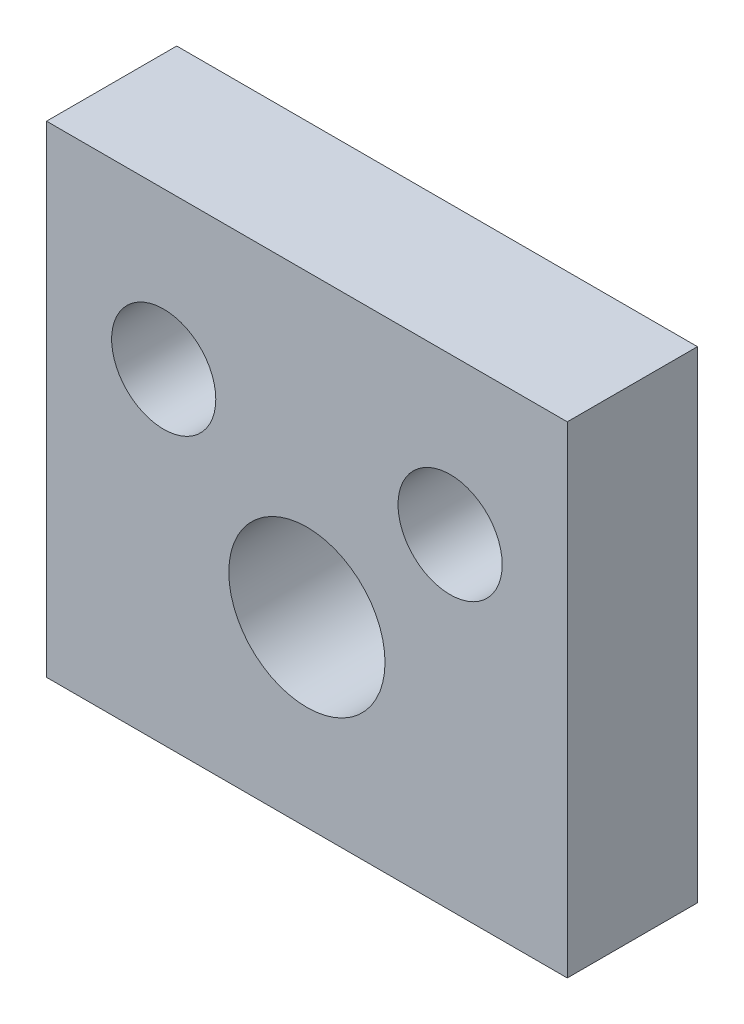
ISO-10303-21;
HEADER;
FILE_DESCRIPTION(('STEP AP214'),'2;1');
FILE_NAME('part.step','',(''),(''),'','','');
FILE_SCHEMA(('AUTOMOTIVE_DESIGN { 1 0 10303 214 1 1 1 1 }'));
ENDSEC;
DATA;
#1=APPLICATION_CONTEXT('core data for automotive mechanical design processes');
#2=APPLICATION_PROTOCOL_DEFINITION('international standard','automotive_design',2000,#1);
#3=PRODUCT_CONTEXT('',#1,'mechanical');
#4=PRODUCT('Part','Part','',(#3));
#5=PRODUCT_RELATED_PRODUCT_CATEGORY('part','',(#4));
#6=PRODUCT_DEFINITION_FORMATION('','',#4);
#7=PRODUCT_DEFINITION_CONTEXT('part definition',#1,'design');
#8=PRODUCT_DEFINITION('design','',#6,#7);
#9=PRODUCT_DEFINITION_SHAPE('','',#8);
#10=(LENGTH_UNIT() NAMED_UNIT(*) SI_UNIT(.MILLI.,.METRE.));
#11=(NAMED_UNIT(*) PLANE_ANGLE_UNIT() SI_UNIT($,.RADIAN.));
#12=(NAMED_UNIT(*) SI_UNIT($,.STERADIAN.) SOLID_ANGLE_UNIT());
#13=UNCERTAINTY_MEASURE_WITH_UNIT(LENGTH_MEASURE(1.E-05),#10,'distance_accuracy_value','');
#14=(GEOMETRIC_REPRESENTATION_CONTEXT(3) GLOBAL_UNCERTAINTY_ASSIGNED_CONTEXT((#13)) GLOBAL_UNIT_ASSIGNED_CONTEXT((#10,
#11,#12)) REPRESENTATION_CONTEXT('',''));
#15=CARTESIAN_POINT('',(0.,0.,0.));
#16=DIRECTION('',(0.,0.,1.));
#17=DIRECTION('',(1.,0.,0.));
#18=AXIS2_PLACEMENT_3D('',#15,#16,#17);
#19=CARTESIAN_POINT('',(6.43178730437478,-23.1504866904766,5.));
#20=DIRECTION('',(1.,0.,0.));
#21=DIRECTION('',(0.,1.,0.));
#22=AXIS2_PLACEMENT_3D('',#19,#20,#21);
#23=PLANE('',#22);
#24=DIRECTION('',(0.,-1.,0.));
#25=VECTOR('',#24,1.);
#26=CARTESIAN_POINT('',(6.43178730437478,-23.1504866904766,0.));
#27=LINE('',#26,#25);
#28=CARTESIAN_POINT('',(6.43178730437478,7.432,0.));
#29=VERTEX_POINT('',#28);
#30=CARTESIAN_POINT('',(6.43178730437478,-11.068,0.));
#31=VERTEX_POINT('',#30);
#32=EDGE_CURVE('E112',#29,#31,#27,.T.);
#33=ORIENTED_EDGE('',*,*,#32,.F.);
#34=DIRECTION('',(0.,0.,-1.));
#35=VECTOR('',#34,1.);
#36=CARTESIAN_POINT('',(6.43178730437478,7.432,5.));
#37=LINE('',#36,#35);
#38=CARTESIAN_POINT('',(6.43178730437478,7.432,5.));
#39=VERTEX_POINT('',#38);
#40=EDGE_CURVE('E11',#39,#29,#37,.T.);
#41=ORIENTED_EDGE('',*,*,#40,.F.);
#42=DIRECTION('',(0.,-1.,0.));
#43=VECTOR('',#42,1.);
#44=CARTESIAN_POINT('',(6.43178730437478,-23.1504866904766,5.));
#45=LINE('',#44,#43);
#46=CARTESIAN_POINT('',(6.43178730437478,-11.068,5.));
#47=VERTEX_POINT('',#46);
#48=EDGE_CURVE('E96',#39,#47,#45,.T.);
#49=ORIENTED_EDGE('',*,*,#48,.T.);
#50=DIRECTION('',(0.,0.,-1.));
#51=VECTOR('',#50,1.);
#52=CARTESIAN_POINT('',(6.43178730437478,-11.068,5.));
#53=LINE('',#52,#51);
#54=EDGE_CURVE('E74',#47,#31,#53,.T.);
#55=ORIENTED_EDGE('',*,*,#54,.T.);
#56=EDGE_LOOP('',(#33,#41,#49,#55));
#57=FACE_BOUND('',#56,.T.);
#58=ADVANCED_FACE('F34',(#57),#23,.T.);
#59=CARTESIAN_POINT('',(-3.56821269562522,7.432,5.));
#60=DIRECTION('',(0.,1.,0.));
#61=DIRECTION('',(-1.,0.,0.));
#62=AXIS2_PLACEMENT_3D('',#59,#60,#61);
#63=PLANE('',#62);
#64=DIRECTION('',(1.,0.,0.));
#65=VECTOR('',#64,1.);
#66=CARTESIAN_POINT('',(-3.56821269562522,7.432,0.));
#67=LINE('',#66,#65);
#68=CARTESIAN_POINT('',(-13.5682126956252,7.432,0.));
#69=VERTEX_POINT('',#68);
#70=EDGE_CURVE('E86',#69,#29,#67,.T.);
#71=ORIENTED_EDGE('',*,*,#70,.F.);
#72=DIRECTION('',(0.,0.,-1.));
#73=VECTOR('',#72,1.);
#74=CARTESIAN_POINT('',(-13.5682126956252,7.432,5.));
#75=LINE('',#74,#73);
#76=CARTESIAN_POINT('',(-13.5682126956252,7.432,5.));
#77=VERTEX_POINT('',#76);
#78=EDGE_CURVE('E43',#77,#69,#75,.T.);
#79=ORIENTED_EDGE('',*,*,#78,.F.);
#80=DIRECTION('',(1.,0.,0.));
#81=VECTOR('',#80,1.);
#82=CARTESIAN_POINT('',(-3.56821269562522,7.432,5.));
#83=LINE('',#82,#81);
#84=EDGE_CURVE('E84',#77,#39,#83,.T.);
#85=ORIENTED_EDGE('',*,*,#84,.T.);
#86=ORIENTED_EDGE('',*,*,#40,.T.);
#87=EDGE_LOOP('',(#71,#79,#85,#86));
#88=FACE_BOUND('',#87,.T.);
#89=ADVANCED_FACE('F82',(#88),#63,.T.);
#90=CARTESIAN_POINT('',(-13.5682126956252,-23.1504866904766,5.));
#91=DIRECTION('',(1.,0.,0.));
#92=DIRECTION('',(0.,0.,-1.));
#93=AXIS2_PLACEMENT_3D('',#90,#91,#92);
#94=PLANE('',#93);
#95=DIRECTION('',(0.,-1.,0.));
#96=VECTOR('',#95,1.);
#97=CARTESIAN_POINT('',(-13.5682126956252,-23.1504866904766,0.));
#98=LINE('',#97,#96);
#99=CARTESIAN_POINT('',(-13.5682126956252,-11.068,0.));
#100=VERTEX_POINT('',#99);
#101=EDGE_CURVE('E115',#69,#100,#98,.T.);
#102=ORIENTED_EDGE('',*,*,#101,.T.);
#103=DIRECTION('',(0.,0.,-1.));
#104=VECTOR('',#103,1.);
#105=CARTESIAN_POINT('',(-13.5682126956252,-11.068,5.));
#106=LINE('',#105,#104);
#107=CARTESIAN_POINT('',(-13.5682126956252,-11.068,5.));
#108=VERTEX_POINT('',#107);
#109=EDGE_CURVE('E89',#108,#100,#106,.T.);
#110=ORIENTED_EDGE('',*,*,#109,.F.);
#111=DIRECTION('',(0.,-1.,0.));
#112=VECTOR('',#111,1.);
#113=CARTESIAN_POINT('',(-13.5682126956252,-23.1504866904766,5.));
#114=LINE('',#113,#112);
#115=EDGE_CURVE('E91',#77,#108,#114,.T.);
#116=ORIENTED_EDGE('',*,*,#115,.F.);
#117=ORIENTED_EDGE('',*,*,#78,.T.);
#118=EDGE_LOOP('',(#102,#110,#116,#117));
#119=FACE_BOUND('',#118,.T.);
#120=ADVANCED_FACE('F92',(#119),#94,.F.);
#121=CARTESIAN_POINT('',(-9.06821269562522,1.432,5.));
#122=DIRECTION('',(0.,0.,-1.));
#123=DIRECTION('',(-1.,0.,0.));
#124=AXIS2_PLACEMENT_3D('',#121,#122,#123);
#125=CYLINDRICAL_SURFACE('',#124,2.);
#126=CARTESIAN_POINT('',(-9.06821269562522,1.432,5.));
#127=DIRECTION('',(0.,0.,1.));
#128=DIRECTION('',(1.,0.,0.));
#129=AXIS2_PLACEMENT_3D('',#126,#127,#128);
#130=CIRCLE('',#129,2.);
#131=CARTESIAN_POINT('',(-7.06821269562522,1.432,5.));
#132=VERTEX_POINT('',#131);
#133=EDGE_CURVE('E103',#132,#132,#130,.T.);
#134=ORIENTED_EDGE('',*,*,#133,.T.);
#135=EDGE_LOOP('',(#134));
#136=FACE_BOUND('',#135,.T.);
#137=CARTESIAN_POINT('',(-9.06821269562522,1.432,0.));
#138=DIRECTION('',(0.,0.,1.));
#139=DIRECTION('',(1.,0.,0.));
#140=AXIS2_PLACEMENT_3D('',#137,#138,#139);
#141=CIRCLE('',#140,2.);
#142=CARTESIAN_POINT('',(-7.06821269562522,1.432,0.));
#143=VERTEX_POINT('',#142);
#144=EDGE_CURVE('E118',#143,#143,#141,.T.);
#145=ORIENTED_EDGE('',*,*,#144,.F.);
#146=EDGE_LOOP('',(#145));
#147=FACE_BOUND('',#146,.T.);
#148=ADVANCED_FACE('F136',(#136,#147),#125,.F.);
#149=CARTESIAN_POINT('',(-3.56821269562522,-11.068,5.));
#150=DIRECTION('',(0.,1.,0.));
#151=DIRECTION('',(-1.,0.,0.));
#152=AXIS2_PLACEMENT_3D('',#149,#150,#151);
#153=PLANE('',#152);
#154=DIRECTION('',(1.,0.,0.));
#155=VECTOR('',#154,1.);
#156=CARTESIAN_POINT('',(-3.56821269562522,-11.068,0.));
#157=LINE('',#156,#155);
#158=EDGE_CURVE('E67',#100,#31,#157,.T.);
#159=ORIENTED_EDGE('',*,*,#158,.T.);
#160=ORIENTED_EDGE('',*,*,#54,.F.);
#161=DIRECTION('',(1.,0.,0.));
#162=VECTOR('',#161,1.);
#163=CARTESIAN_POINT('',(-3.56821269562522,-11.068,5.));
#164=LINE('',#163,#162);
#165=EDGE_CURVE('E51',#108,#47,#164,.T.);
#166=ORIENTED_EDGE('',*,*,#165,.F.);
#167=ORIENTED_EDGE('',*,*,#109,.T.);
#168=EDGE_LOOP('',(#159,#160,#166,#167));
#169=FACE_BOUND('',#168,.T.);
#170=ADVANCED_FACE('F126',(#169),#153,.F.);
#171=CARTESIAN_POINT('',(-3.56821269562522,-4.068,5.));
#172=DIRECTION('',(0.,0.,-1.));
#173=DIRECTION('',(-1.,0.,0.));
#174=AXIS2_PLACEMENT_3D('',#171,#172,#173);
#175=CYLINDRICAL_SURFACE('',#174,3.);
#176=CARTESIAN_POINT('',(-3.56821269562522,-4.068,5.));
#177=DIRECTION('',(0.,0.,1.));
#178=DIRECTION('',(1.,0.,0.));
#179=AXIS2_PLACEMENT_3D('',#176,#177,#178);
#180=CIRCLE('',#179,3.);
#181=CARTESIAN_POINT('',(-0.568212695625217,-4.068,5.));
#182=VERTEX_POINT('',#181);
#183=EDGE_CURVE('E98',#182,#182,#180,.T.);
#184=ORIENTED_EDGE('',*,*,#183,.T.);
#185=EDGE_LOOP('',(#184));
#186=FACE_BOUND('',#185,.T.);
#187=CARTESIAN_POINT('',(-3.56821269562522,-4.068,0.));
#188=DIRECTION('',(0.,0.,1.));
#189=DIRECTION('',(1.,0.,0.));
#190=AXIS2_PLACEMENT_3D('',#187,#188,#189);
#191=CIRCLE('',#190,3.);
#192=CARTESIAN_POINT('',(-0.568212695625217,-4.068,0.));
#193=VERTEX_POINT('',#192);
#194=EDGE_CURVE('E109',#193,#193,#191,.T.);
#195=ORIENTED_EDGE('',*,*,#194,.F.);
#196=EDGE_LOOP('',(#195));
#197=FACE_BOUND('',#196,.T.);
#198=ADVANCED_FACE('F36',(#186,#197),#175,.F.);
#199=CARTESIAN_POINT('',(1.93178730437478,1.432,5.));
#200=DIRECTION('',(0.,0.,-1.));
#201=DIRECTION('',(-1.,0.,0.));
#202=AXIS2_PLACEMENT_3D('',#199,#200,#201);
#203=CYLINDRICAL_SURFACE('',#202,2.);
#204=CARTESIAN_POINT('',(1.93178730437478,1.432,5.));
#205=DIRECTION('',(0.,0.,1.));
#206=DIRECTION('',(1.,0.,0.));
#207=AXIS2_PLACEMENT_3D('',#204,#205,#206);
#208=CIRCLE('',#207,2.);
#209=CARTESIAN_POINT('',(3.93178730437478,1.432,5.));
#210=VERTEX_POINT('',#209);
#211=EDGE_CURVE('E106',#210,#210,#208,.T.);
#212=ORIENTED_EDGE('',*,*,#211,.T.);
#213=EDGE_LOOP('',(#212));
#214=FACE_BOUND('',#213,.T.);
#215=CARTESIAN_POINT('',(1.93178730437478,1.432,0.));
#216=DIRECTION('',(0.,0.,1.));
#217=DIRECTION('',(1.,0.,0.));
#218=AXIS2_PLACEMENT_3D('',#215,#216,#217);
#219=CIRCLE('',#218,2.);
#220=CARTESIAN_POINT('',(3.93178730437478,1.432,0.));
#221=VERTEX_POINT('',#220);
#222=EDGE_CURVE('E121',#221,#221,#219,.T.);
#223=ORIENTED_EDGE('',*,*,#222,.F.);
#224=EDGE_LOOP('',(#223));
#225=FACE_BOUND('',#224,.T.);
#226=ADVANCED_FACE('F142',(#214,#225),#203,.F.);
#227=CARTESIAN_POINT('',(-3.56821269562522,-23.1504866904766,5.));
#228=DIRECTION('',(0.,0.,1.));
#229=DIRECTION('',(1.,0.,0.));
#230=AXIS2_PLACEMENT_3D('',#227,#228,#229);
#231=PLANE('',#230);
#232=ORIENTED_EDGE('',*,*,#183,.F.);
#233=EDGE_LOOP('',(#232));
#234=FACE_BOUND('',#233,.T.);
#235=ORIENTED_EDGE('',*,*,#48,.F.);
#236=ORIENTED_EDGE('',*,*,#84,.F.);
#237=ORIENTED_EDGE('',*,*,#115,.T.);
#238=ORIENTED_EDGE('',*,*,#165,.T.);
#239=EDGE_LOOP('',(#235,#236,#237,#238));
#240=FACE_BOUND('',#239,.T.);
#241=ORIENTED_EDGE('',*,*,#133,.F.);
#242=EDGE_LOOP('',(#241));
#243=FACE_BOUND('',#242,.T.);
#244=ORIENTED_EDGE('',*,*,#211,.F.);
#245=EDGE_LOOP('',(#244));
#246=FACE_BOUND('',#245,.T.);
#247=ADVANCED_FACE('F94',(#234,#240,#243,#246),#231,.T.);
#248=CARTESIAN_POINT('',(-3.56821269562522,-23.1504866904766,0.));
#249=DIRECTION('',(0.,0.,1.));
#250=DIRECTION('',(1.,0.,0.));
#251=AXIS2_PLACEMENT_3D('',#248,#249,#250);
#252=PLANE('',#251);
#253=ORIENTED_EDGE('',*,*,#194,.T.);
#254=EDGE_LOOP('',(#253));
#255=FACE_BOUND('',#254,.T.);
#256=ORIENTED_EDGE('',*,*,#32,.T.);
#257=ORIENTED_EDGE('',*,*,#158,.F.);
#258=ORIENTED_EDGE('',*,*,#101,.F.);
#259=ORIENTED_EDGE('',*,*,#70,.T.);
#260=EDGE_LOOP('',(#256,#257,#258,#259));
#261=FACE_BOUND('',#260,.T.);
#262=ORIENTED_EDGE('',*,*,#144,.T.);
#263=EDGE_LOOP('',(#262));
#264=FACE_BOUND('',#263,.T.);
#265=ORIENTED_EDGE('',*,*,#222,.T.);
#266=EDGE_LOOP('',(#265));
#267=FACE_BOUND('',#266,.T.);
#268=ADVANCED_FACE('F127',(#255,#261,#264,#267),#252,.F.);
#269=CLOSED_SHELL('',(#58,#89,#120,#148,#170,#198,#226,#247,#268));
#270=MANIFOLD_SOLID_BREP('B2',#269);
#271=ADVANCED_BREP_SHAPE_REPRESENTATION('',(#18,#270),#14);
#272=SHAPE_DEFINITION_REPRESENTATION(#9,#271);
ENDSEC;
END-ISO-10303-21;
